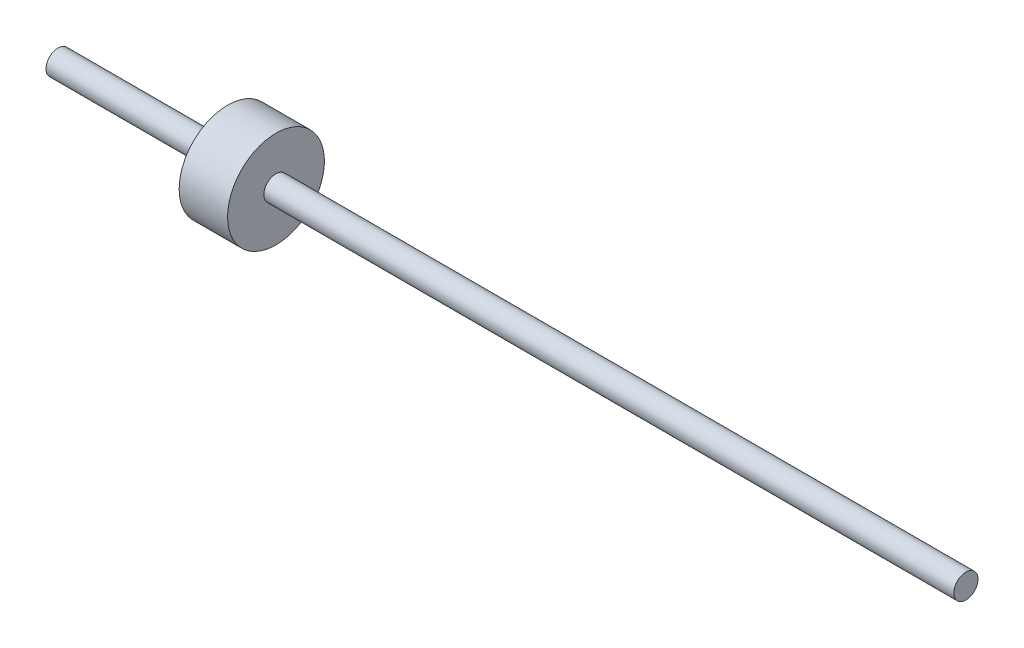
ISO-10303-21;
HEADER;
FILE_DESCRIPTION(('STEP AP214'),'2;1');
FILE_NAME('part.step','',(''),(''),'','','');
FILE_SCHEMA(('AUTOMOTIVE_DESIGN { 1 0 10303 214 1 1 1 1 }'));
ENDSEC;
DATA;
#1=APPLICATION_CONTEXT('core data for automotive mechanical design processes');
#2=APPLICATION_PROTOCOL_DEFINITION('international standard','automotive_design',2000,#1);
#3=PRODUCT_CONTEXT('',#1,'mechanical');
#4=PRODUCT('Part','Part','',(#3));
#5=PRODUCT_RELATED_PRODUCT_CATEGORY('part','',(#4));
#6=PRODUCT_DEFINITION_FORMATION('','',#4);
#7=PRODUCT_DEFINITION_CONTEXT('part definition',#1,'design');
#8=PRODUCT_DEFINITION('design','',#6,#7);
#9=PRODUCT_DEFINITION_SHAPE('','',#8);
#10=(LENGTH_UNIT() NAMED_UNIT(*) SI_UNIT(.MILLI.,.METRE.));
#11=(NAMED_UNIT(*) PLANE_ANGLE_UNIT() SI_UNIT($,.RADIAN.));
#12=(NAMED_UNIT(*) SI_UNIT($,.STERADIAN.) SOLID_ANGLE_UNIT());
#13=UNCERTAINTY_MEASURE_WITH_UNIT(LENGTH_MEASURE(1.E-05),#10,'distance_accuracy_value','');
#14=(GEOMETRIC_REPRESENTATION_CONTEXT(3) GLOBAL_UNCERTAINTY_ASSIGNED_CONTEXT((#13)) GLOBAL_UNIT_ASSIGNED_CONTEXT((#10,
#11,#12)) REPRESENTATION_CONTEXT('',''));
#15=CARTESIAN_POINT('',(0.,0.,0.));
#16=DIRECTION('',(0.,0.,1.));
#17=DIRECTION('',(1.,0.,0.));
#18=AXIS2_PLACEMENT_3D('',#15,#16,#17);
#19=CARTESIAN_POINT('',(150.,0.,0.));
#20=DIRECTION('',(-1.,0.,0.));
#21=DIRECTION('',(0.,0.,1.));
#22=AXIS2_PLACEMENT_3D('',#19,#20,#21);
#23=CYLINDRICAL_SURFACE('',#22,2.);
#24=CARTESIAN_POINT('',(150.,0.,0.));
#25=DIRECTION('',(1.,0.,0.));
#26=DIRECTION('',(0.,0.,-1.));
#27=AXIS2_PLACEMENT_3D('',#24,#25,#26);
#28=CIRCLE('',#27,2.);
#29=CARTESIAN_POINT('',(150.,0.,-2.));
#30=VERTEX_POINT('',#29);
#31=EDGE_CURVE('E53',#30,#30,#28,.T.);
#32=ORIENTED_EDGE('',*,*,#31,.F.);
#33=EDGE_LOOP('',(#32));
#34=FACE_BOUND('',#33,.T.);
#35=CARTESIAN_POINT('',(36.,0.,0.));
#36=DIRECTION('',(-1.,0.,0.));
#37=DIRECTION('',(0.,0.,1.));
#38=AXIS2_PLACEMENT_3D('',#35,#36,#37);
#39=CIRCLE('',#38,2.);
#40=CARTESIAN_POINT('',(36.,0.,2.));
#41=VERTEX_POINT('',#40);
#42=EDGE_CURVE('E11',#41,#41,#39,.T.);
#43=ORIENTED_EDGE('',*,*,#42,.F.);
#44=EDGE_LOOP('',(#43));
#45=FACE_BOUND('',#44,.T.);
#46=ADVANCED_FACE('F46',(#34,#45),#23,.T.);
#47=CARTESIAN_POINT('',(150.,0.,0.));
#48=DIRECTION('',(1.,0.,0.));
#49=DIRECTION('',(0.,0.,-1.));
#50=AXIS2_PLACEMENT_3D('',#47,#48,#49);
#51=PLANE('',#50);
#52=ORIENTED_EDGE('',*,*,#31,.T.);
#53=EDGE_LOOP('',(#52));
#54=FACE_BOUND('',#53,.T.);
#55=ADVANCED_FACE('F83',(#54),#51,.T.);
#56=CARTESIAN_POINT('',(36.,0.,0.));
#57=DIRECTION('',(-1.,0.,0.));
#58=DIRECTION('',(0.,0.,1.));
#59=AXIS2_PLACEMENT_3D('',#56,#57,#58);
#60=PLANE('',#59);
#61=ORIENTED_EDGE('',*,*,#42,.T.);
#62=EDGE_LOOP('',(#61));
#63=FACE_BOUND('',#62,.T.);
#64=CARTESIAN_POINT('',(36.,-0.186353814927879,0.));
#65=DIRECTION('',(-1.,0.,0.));
#66=DIRECTION('',(0.,0.,1.));
#67=AXIS2_PLACEMENT_3D('',#64,#65,#66);
#68=CIRCLE('',#67,8.00000000000001);
#69=CARTESIAN_POINT('',(36.,-0.186353814927879,8.00000000000001));
#70=VERTEX_POINT('',#69);
#71=EDGE_CURVE('E71',#70,#70,#68,.T.);
#72=ORIENTED_EDGE('',*,*,#71,.F.);
#73=EDGE_LOOP('',(#72));
#74=FACE_BOUND('',#73,.T.);
#75=ADVANCED_FACE('F80',(#63,#74),#60,.F.);
#76=CARTESIAN_POINT('',(28.,0.,0.));
#77=DIRECTION('',(-1.,0.,0.));
#78=DIRECTION('',(0.,0.,1.));
#79=AXIS2_PLACEMENT_3D('',#76,#77,#78);
#80=PLANE('',#79);
#81=CARTESIAN_POINT('',(28.,0.,0.));
#82=DIRECTION('',(-1.,0.,0.));
#83=DIRECTION('',(0.,0.,1.));
#84=AXIS2_PLACEMENT_3D('',#81,#82,#83);
#85=CIRCLE('',#84,2.);
#86=CARTESIAN_POINT('',(28.,0.,2.));
#87=VERTEX_POINT('',#86);
#88=EDGE_CURVE('E62',#87,#87,#85,.T.);
#89=ORIENTED_EDGE('',*,*,#88,.F.);
#90=EDGE_LOOP('',(#89));
#91=FACE_BOUND('',#90,.T.);
#92=CARTESIAN_POINT('',(28.,-0.186353814927879,0.));
#93=DIRECTION('',(-1.,0.,0.));
#94=DIRECTION('',(0.,0.,1.));
#95=AXIS2_PLACEMENT_3D('',#92,#93,#94);
#96=CIRCLE('',#95,8.00000000000001);
#97=CARTESIAN_POINT('',(28.,-0.186353814927879,8.00000000000001));
#98=VERTEX_POINT('',#97);
#99=EDGE_CURVE('E65',#98,#98,#96,.T.);
#100=ORIENTED_EDGE('',*,*,#99,.T.);
#101=EDGE_LOOP('',(#100));
#102=FACE_BOUND('',#101,.T.);
#103=ADVANCED_FACE('F82',(#91,#102),#80,.T.);
#104=CARTESIAN_POINT('',(36.,-0.186353814927879,0.));
#105=DIRECTION('',(-1.,0.,0.));
#106=DIRECTION('',(0.,0.,1.));
#107=AXIS2_PLACEMENT_3D('',#104,#105,#106);
#108=CYLINDRICAL_SURFACE('',#107,8.00000000000001);
#109=ORIENTED_EDGE('',*,*,#71,.T.);
#110=EDGE_LOOP('',(#109));
#111=FACE_BOUND('',#110,.T.);
#112=ORIENTED_EDGE('',*,*,#99,.F.);
#113=EDGE_LOOP('',(#112));
#114=FACE_BOUND('',#113,.T.);
#115=ADVANCED_FACE('F77',(#111,#114),#108,.T.);
#116=CARTESIAN_POINT('',(0.,0.,0.));
#117=DIRECTION('',(1.,0.,0.));
#118=DIRECTION('',(0.,0.,-1.));
#119=AXIS2_PLACEMENT_3D('',#116,#117,#118);
#120=PLANE('',#119);
#121=CARTESIAN_POINT('',(0.,0.,0.));
#122=DIRECTION('',(1.,0.,0.));
#123=DIRECTION('',(0.,0.,-1.));
#124=AXIS2_PLACEMENT_3D('',#121,#122,#123);
#125=CIRCLE('',#124,2.);
#126=CARTESIAN_POINT('',(0.,0.,-2.));
#127=VERTEX_POINT('',#126);
#128=EDGE_CURVE('E57',#127,#127,#125,.T.);
#129=ORIENTED_EDGE('',*,*,#128,.F.);
#130=EDGE_LOOP('',(#129));
#131=FACE_BOUND('',#130,.T.);
#132=ADVANCED_FACE('F85',(#131),#120,.F.);
#133=ORIENTED_EDGE('',*,*,#88,.T.);
#134=EDGE_LOOP('',(#133));
#135=FACE_BOUND('',#134,.T.);
#136=ORIENTED_EDGE('',*,*,#128,.T.);
#137=EDGE_LOOP('',(#136));
#138=FACE_BOUND('',#137,.T.);
#139=ADVANCED_FACE('F48',(#135,#138),#23,.T.);
#140=CLOSED_SHELL('',(#46,#55,#75,#103,#115,#132,#139));
#141=MANIFOLD_SOLID_BREP('B2',#140);
#142=ADVANCED_BREP_SHAPE_REPRESENTATION('',(#18,#141),#14);
#143=SHAPE_DEFINITION_REPRESENTATION(#9,#142);
ENDSEC;
END-ISO-10303-21;
